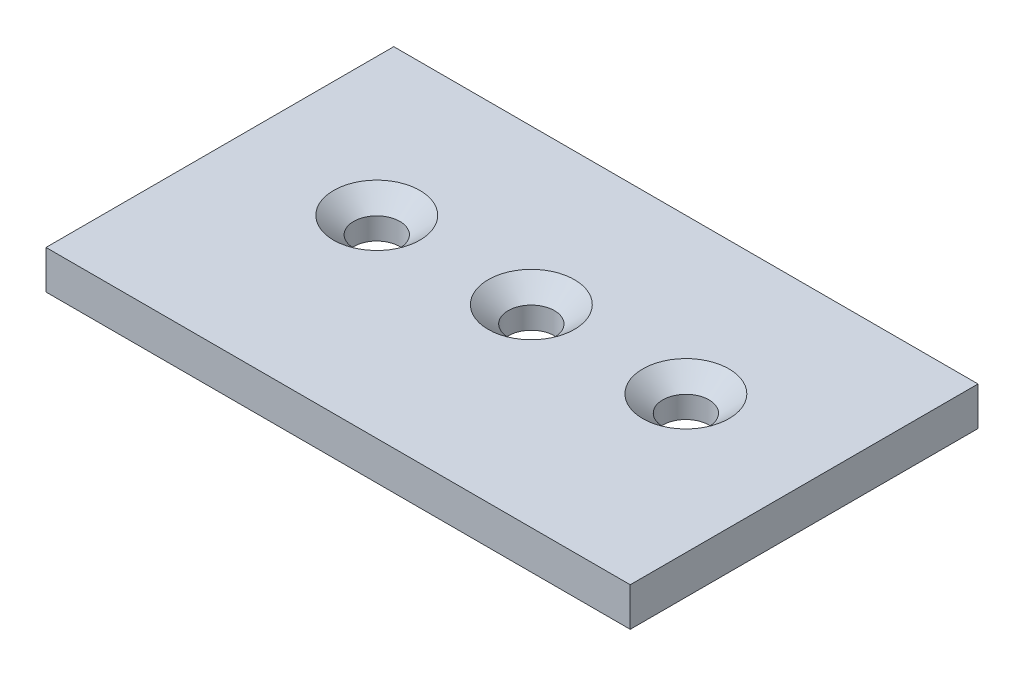
ISO-10303-21;
HEADER;
FILE_DESCRIPTION(('STEP AP214'),'2;1');
FILE_NAME('part.step','',(''),(''),'','','');
FILE_SCHEMA(('AUTOMOTIVE_DESIGN { 1 0 10303 214 1 1 1 1 }'));
ENDSEC;
DATA;
#1=APPLICATION_CONTEXT('core data for automotive mechanical design processes');
#2=APPLICATION_PROTOCOL_DEFINITION('international standard','automotive_design',2000,#1);
#3=PRODUCT_CONTEXT('',#1,'mechanical');
#4=PRODUCT('Part','Part','',(#3));
#5=PRODUCT_RELATED_PRODUCT_CATEGORY('part','',(#4));
#6=PRODUCT_DEFINITION_FORMATION('','',#4);
#7=PRODUCT_DEFINITION_CONTEXT('part definition',#1,'design');
#8=PRODUCT_DEFINITION('design','',#6,#7);
#9=PRODUCT_DEFINITION_SHAPE('','',#8);
#10=(LENGTH_UNIT() NAMED_UNIT(*) SI_UNIT(.MILLI.,.METRE.));
#11=(NAMED_UNIT(*) PLANE_ANGLE_UNIT() SI_UNIT($,.RADIAN.));
#12=(NAMED_UNIT(*) SI_UNIT($,.STERADIAN.) SOLID_ANGLE_UNIT());
#13=UNCERTAINTY_MEASURE_WITH_UNIT(LENGTH_MEASURE(1.E-05),#10,'distance_accuracy_value','');
#14=(GEOMETRIC_REPRESENTATION_CONTEXT(3) GLOBAL_UNCERTAINTY_ASSIGNED_CONTEXT((#13)) GLOBAL_UNIT_ASSIGNED_CONTEXT((#10,
#11,#12)) REPRESENTATION_CONTEXT('',''));
#15=CARTESIAN_POINT('',(0.,0.,0.));
#16=DIRECTION('',(0.,0.,1.));
#17=DIRECTION('',(1.,0.,0.));
#18=AXIS2_PLACEMENT_3D('',#15,#16,#17);
#19=CARTESIAN_POINT('',(0.,3.175,0.));
#20=DIRECTION('',(-1.,0.,0.));
#21=DIRECTION('',(0.,0.,1.));
#22=AXIS2_PLACEMENT_3D('',#19,#20,#21);
#23=PLANE('',#22);
#24=DIRECTION('',(0.,0.,-1.));
#25=VECTOR('',#24,1.);
#26=CARTESIAN_POINT('',(0.,0.,0.));
#27=LINE('',#26,#25);
#28=CARTESIAN_POINT('',(0.,0.,0.));
#29=VERTEX_POINT('',#28);
#30=CARTESIAN_POINT('',(0.,0.,-28.575));
#31=VERTEX_POINT('',#30);
#32=EDGE_CURVE('E96',#29,#31,#27,.T.);
#33=ORIENTED_EDGE('',*,*,#32,.T.);
#34=DIRECTION('',(0.,-1.,0.));
#35=VECTOR('',#34,1.);
#36=CARTESIAN_POINT('',(0.,3.175,-28.575));
#37=LINE('',#36,#35);
#38=CARTESIAN_POINT('',(0.,3.175,-28.575));
#39=VERTEX_POINT('',#38);
#40=EDGE_CURVE('E11',#39,#31,#37,.T.);
#41=ORIENTED_EDGE('',*,*,#40,.F.);
#42=DIRECTION('',(0.,0.,-1.));
#43=VECTOR('',#42,1.);
#44=CARTESIAN_POINT('',(0.,3.175,0.));
#45=LINE('',#44,#43);
#46=CARTESIAN_POINT('',(0.,3.175,0.));
#47=VERTEX_POINT('',#46);
#48=EDGE_CURVE('E84',#47,#39,#45,.T.);
#49=ORIENTED_EDGE('',*,*,#48,.F.);
#50=DIRECTION('',(0.,-1.,0.));
#51=VECTOR('',#50,1.);
#52=CARTESIAN_POINT('',(0.,3.175,0.));
#53=LINE('',#52,#51);
#54=EDGE_CURVE('E92',#47,#29,#53,.T.);
#55=ORIENTED_EDGE('',*,*,#54,.T.);
#56=EDGE_LOOP('',(#33,#41,#49,#55));
#57=FACE_BOUND('',#56,.T.);
#58=ADVANCED_FACE('F33',(#57),#23,.F.);
#59=CARTESIAN_POINT('',(0.,3.175,-28.575));
#60=DIRECTION('',(0.,0.,1.));
#61=DIRECTION('',(1.,0.,0.));
#62=AXIS2_PLACEMENT_3D('',#59,#60,#61);
#63=PLANE('',#62);
#64=DIRECTION('',(-1.,0.,0.));
#65=VECTOR('',#64,1.);
#66=CARTESIAN_POINT('',(0.,0.,-28.575));
#67=LINE('',#66,#65);
#68=CARTESIAN_POINT('',(-48.006,0.,-28.575));
#69=VERTEX_POINT('',#68);
#70=EDGE_CURVE('E88',#31,#69,#67,.T.);
#71=ORIENTED_EDGE('',*,*,#70,.T.);
#72=DIRECTION('',(0.,-1.,0.));
#73=VECTOR('',#72,1.);
#74=CARTESIAN_POINT('',(-48.006,3.175,-28.575));
#75=LINE('',#74,#73);
#76=CARTESIAN_POINT('',(-48.006,3.175,-28.575));
#77=VERTEX_POINT('',#76);
#78=EDGE_CURVE('E41',#77,#69,#75,.T.);
#79=ORIENTED_EDGE('',*,*,#78,.F.);
#80=DIRECTION('',(-1.,0.,0.));
#81=VECTOR('',#80,1.);
#82=CARTESIAN_POINT('',(0.,3.175,-28.575));
#83=LINE('',#82,#81);
#84=EDGE_CURVE('E79',#39,#77,#83,.T.);
#85=ORIENTED_EDGE('',*,*,#84,.F.);
#86=ORIENTED_EDGE('',*,*,#40,.T.);
#87=EDGE_LOOP('',(#71,#79,#85,#86));
#88=FACE_BOUND('',#87,.T.);
#89=ADVANCED_FACE('F87',(#88),#63,.F.);
#90=CARTESIAN_POINT('',(-48.006,3.175,0.));
#91=DIRECTION('',(1.,0.,0.));
#92=DIRECTION('',(0.,0.,-1.));
#93=AXIS2_PLACEMENT_3D('',#90,#91,#92);
#94=PLANE('',#93);
#95=DIRECTION('',(0.,0.,1.));
#96=VECTOR('',#95,1.);
#97=CARTESIAN_POINT('',(-48.006,0.,0.));
#98=LINE('',#97,#96);
#99=CARTESIAN_POINT('',(-48.006,0.,0.));
#100=VERTEX_POINT('',#99);
#101=EDGE_CURVE('E66',#69,#100,#98,.T.);
#102=ORIENTED_EDGE('',*,*,#101,.T.);
#103=DIRECTION('',(0.,-1.,0.));
#104=VECTOR('',#103,1.);
#105=CARTESIAN_POINT('',(-48.006,3.175,0.));
#106=LINE('',#105,#104);
#107=CARTESIAN_POINT('',(-48.006,3.175,0.));
#108=VERTEX_POINT('',#107);
#109=EDGE_CURVE('E89',#108,#100,#106,.T.);
#110=ORIENTED_EDGE('',*,*,#109,.F.);
#111=DIRECTION('',(0.,0.,1.));
#112=VECTOR('',#111,1.);
#113=CARTESIAN_POINT('',(-48.006,3.175,0.));
#114=LINE('',#113,#112);
#115=EDGE_CURVE('E82',#77,#108,#114,.T.);
#116=ORIENTED_EDGE('',*,*,#115,.F.);
#117=ORIENTED_EDGE('',*,*,#78,.T.);
#118=EDGE_LOOP('',(#102,#110,#116,#117));
#119=FACE_BOUND('',#118,.T.);
#120=ADVANCED_FACE('F90',(#119),#94,.F.);
#121=CARTESIAN_POINT('',(0.,3.175,0.));
#122=DIRECTION('',(0.,0.,-1.));
#123=DIRECTION('',(-1.,0.,0.));
#124=AXIS2_PLACEMENT_3D('',#121,#122,#123);
#125=PLANE('',#124);
#126=DIRECTION('',(1.,0.,0.));
#127=VECTOR('',#126,1.);
#128=CARTESIAN_POINT('',(0.,0.,0.));
#129=LINE('',#128,#127);
#130=EDGE_CURVE('E72',#100,#29,#129,.T.);
#131=ORIENTED_EDGE('',*,*,#130,.T.);
#132=ORIENTED_EDGE('',*,*,#54,.F.);
#133=DIRECTION('',(1.,0.,0.));
#134=VECTOR('',#133,1.);
#135=CARTESIAN_POINT('',(0.,3.175,0.));
#136=LINE('',#135,#134);
#137=EDGE_CURVE('E49',#108,#47,#136,.T.);
#138=ORIENTED_EDGE('',*,*,#137,.F.);
#139=ORIENTED_EDGE('',*,*,#109,.T.);
#140=EDGE_LOOP('',(#131,#132,#138,#139));
#141=FACE_BOUND('',#140,.T.);
#142=ADVANCED_FACE('F104',(#141),#125,.F.);
#143=CARTESIAN_POINT('',(0.,3.175,0.));
#144=DIRECTION('',(0.,1.,0.));
#145=DIRECTION('',(0.,0.,1.));
#146=AXIS2_PLACEMENT_3D('',#143,#144,#145);
#147=PLANE('',#146);
#148=CARTESIAN_POINT('',(-11.303,3.175,-15.875));
#149=DIRECTION('',(0.,1.,0.));
#150=DIRECTION('',(0.,0.,1.));
#151=AXIS2_PLACEMENT_3D('',#148,#149,#150);
#152=CIRCLE('',#151,3.5433);
#153=CARTESIAN_POINT('',(-11.303,3.175,-12.3317));
#154=VERTEX_POINT('',#153);
#155=EDGE_CURVE('E133',#154,#154,#152,.T.);
#156=ORIENTED_EDGE('',*,*,#155,.F.);
#157=EDGE_LOOP('',(#156));
#158=FACE_BOUND('',#157,.T.);
#159=CARTESIAN_POINT('',(-36.703,3.175,-15.875));
#160=DIRECTION('',(0.,1.,0.));
#161=DIRECTION('',(0.,0.,1.));
#162=AXIS2_PLACEMENT_3D('',#159,#160,#161);
#163=CIRCLE('',#162,3.5433);
#164=CARTESIAN_POINT('',(-36.703,3.175,-12.3317));
#165=VERTEX_POINT('',#164);
#166=EDGE_CURVE('E124',#165,#165,#163,.T.);
#167=ORIENTED_EDGE('',*,*,#166,.F.);
#168=EDGE_LOOP('',(#167));
#169=FACE_BOUND('',#168,.T.);
#170=CARTESIAN_POINT('',(-24.003,3.175,-15.875));
#171=DIRECTION('',(0.,1.,0.));
#172=DIRECTION('',(0.,0.,1.));
#173=AXIS2_PLACEMENT_3D('',#170,#171,#172);
#174=CIRCLE('',#173,3.5433);
#175=CARTESIAN_POINT('',(-24.003,3.175,-12.3317));
#176=VERTEX_POINT('',#175);
#177=EDGE_CURVE('E115',#176,#176,#174,.T.);
#178=ORIENTED_EDGE('',*,*,#177,.F.);
#179=EDGE_LOOP('',(#178));
#180=FACE_BOUND('',#179,.T.);
#181=ORIENTED_EDGE('',*,*,#48,.T.);
#182=ORIENTED_EDGE('',*,*,#84,.T.);
#183=ORIENTED_EDGE('',*,*,#115,.T.);
#184=ORIENTED_EDGE('',*,*,#137,.T.);
#185=EDGE_LOOP('',(#181,#182,#183,#184));
#186=FACE_BOUND('',#185,.T.);
#187=ADVANCED_FACE('F80',(#158,#169,#180,#186),#147,.T.);
#188=CARTESIAN_POINT('',(0.,0.,0.));
#189=DIRECTION('',(0.,1.,0.));
#190=DIRECTION('',(0.,0.,1.));
#191=AXIS2_PLACEMENT_3D('',#188,#189,#190);
#192=PLANE('',#191);
#193=CARTESIAN_POINT('',(-11.303,0.,-15.875));
#194=DIRECTION('',(0.,1.,0.));
#195=DIRECTION('',(0.,0.,1.));
#196=AXIS2_PLACEMENT_3D('',#193,#194,#195);
#197=CIRCLE('',#196,1.89865);
#198=CARTESIAN_POINT('',(-11.303,0.,-13.97635));
#199=VERTEX_POINT('',#198);
#200=EDGE_CURVE('E127',#199,#199,#197,.T.);
#201=ORIENTED_EDGE('',*,*,#200,.T.);
#202=EDGE_LOOP('',(#201));
#203=FACE_BOUND('',#202,.T.);
#204=CARTESIAN_POINT('',(-36.703,0.,-15.875));
#205=DIRECTION('',(0.,1.,0.));
#206=DIRECTION('',(0.,0.,1.));
#207=AXIS2_PLACEMENT_3D('',#204,#205,#206);
#208=CIRCLE('',#207,1.89865);
#209=CARTESIAN_POINT('',(-36.703,0.,-13.97635));
#210=VERTEX_POINT('',#209);
#211=EDGE_CURVE('E118',#210,#210,#208,.T.);
#212=ORIENTED_EDGE('',*,*,#211,.T.);
#213=EDGE_LOOP('',(#212));
#214=FACE_BOUND('',#213,.T.);
#215=CARTESIAN_POINT('',(-24.003,0.,-15.875));
#216=DIRECTION('',(0.,1.,0.));
#217=DIRECTION('',(0.,0.,1.));
#218=AXIS2_PLACEMENT_3D('',#215,#216,#217);
#219=CIRCLE('',#218,1.89865);
#220=CARTESIAN_POINT('',(-24.003,0.,-13.97635));
#221=VERTEX_POINT('',#220);
#222=EDGE_CURVE('E99',#221,#221,#219,.T.);
#223=ORIENTED_EDGE('',*,*,#222,.T.);
#224=EDGE_LOOP('',(#223));
#225=FACE_BOUND('',#224,.T.);
#226=ORIENTED_EDGE('',*,*,#32,.F.);
#227=ORIENTED_EDGE('',*,*,#130,.F.);
#228=ORIENTED_EDGE('',*,*,#101,.F.);
#229=ORIENTED_EDGE('',*,*,#70,.F.);
#230=EDGE_LOOP('',(#226,#227,#228,#229));
#231=FACE_BOUND('',#230,.T.);
#232=ADVANCED_FACE('F107',(#203,#214,#225,#231),#192,.F.);
#233=CARTESIAN_POINT('',(-24.003,3.175,-15.875));
#234=DIRECTION('',(0.,1.,0.));
#235=DIRECTION('',(0.,0.,1.));
#236=AXIS2_PLACEMENT_3D('',#233,#234,#235);
#237=CYLINDRICAL_SURFACE('',#236,1.89864999999999);
#238=ORIENTED_EDGE('',*,*,#222,.F.);
#239=EDGE_LOOP('',(#238));
#240=FACE_BOUND('',#239,.T.);
#241=CARTESIAN_POINT('',(-24.003,1.79497479158429,-15.875));
#242=DIRECTION('',(0.,1.,0.));
#243=DIRECTION('',(0.,0.,1.));
#244=AXIS2_PLACEMENT_3D('',#241,#242,#243);
#245=CIRCLE('',#244,1.89864999999999);
#246=CARTESIAN_POINT('',(-24.003,1.79497479158429,-13.97635));
#247=VERTEX_POINT('',#246);
#248=EDGE_CURVE('E112',#247,#247,#245,.T.);
#249=ORIENTED_EDGE('',*,*,#248,.T.);
#250=EDGE_LOOP('',(#249));
#251=FACE_BOUND('',#250,.T.);
#252=ADVANCED_FACE('F149',(#240,#251),#237,.F.);
#253=CARTESIAN_POINT('',(-24.003,3.175,-15.875));
#254=DIRECTION('',(0.,1.,0.));
#255=DIRECTION('',(0.,0.,1.));
#256=AXIS2_PLACEMENT_3D('',#253,#254,#255);
#257=CONICAL_SURFACE('',#256,3.5433,0.872664625997169);
#258=ORIENTED_EDGE('',*,*,#248,.F.);
#259=EDGE_LOOP('',(#258));
#260=FACE_BOUND('',#259,.T.);
#261=ORIENTED_EDGE('',*,*,#177,.T.);
#262=EDGE_LOOP('',(#261));
#263=FACE_BOUND('',#262,.T.);
#264=ADVANCED_FACE('F146',(#260,#263),#257,.F.);
#265=CARTESIAN_POINT('',(-36.703,3.175,-15.875));
#266=DIRECTION('',(0.,1.,0.));
#267=DIRECTION('',(0.,0.,1.));
#268=AXIS2_PLACEMENT_3D('',#265,#266,#267);
#269=CYLINDRICAL_SURFACE('',#268,1.89864999999999);
#270=ORIENTED_EDGE('',*,*,#211,.F.);
#271=EDGE_LOOP('',(#270));
#272=FACE_BOUND('',#271,.T.);
#273=CARTESIAN_POINT('',(-36.703,1.79497479158429,-15.875));
#274=DIRECTION('',(0.,1.,0.));
#275=DIRECTION('',(0.,0.,1.));
#276=AXIS2_PLACEMENT_3D('',#273,#274,#275);
#277=CIRCLE('',#276,1.89864999999999);
#278=CARTESIAN_POINT('',(-36.703,1.79497479158429,-13.97635));
#279=VERTEX_POINT('',#278);
#280=EDGE_CURVE('E121',#279,#279,#277,.T.);
#281=ORIENTED_EDGE('',*,*,#280,.T.);
#282=EDGE_LOOP('',(#281));
#283=FACE_BOUND('',#282,.T.);
#284=ADVANCED_FACE('F148',(#272,#283),#269,.F.);
#285=CARTESIAN_POINT('',(-36.703,3.175,-15.875));
#286=DIRECTION('',(0.,1.,0.));
#287=DIRECTION('',(0.,0.,1.));
#288=AXIS2_PLACEMENT_3D('',#285,#286,#287);
#289=CONICAL_SURFACE('',#288,3.5433,0.872664625997169);
#290=ORIENTED_EDGE('',*,*,#280,.F.);
#291=EDGE_LOOP('',(#290));
#292=FACE_BOUND('',#291,.T.);
#293=ORIENTED_EDGE('',*,*,#166,.T.);
#294=EDGE_LOOP('',(#293));
#295=FACE_BOUND('',#294,.T.);
#296=ADVANCED_FACE('F156',(#292,#295),#289,.F.);
#297=CARTESIAN_POINT('',(-11.303,3.175,-15.875));
#298=DIRECTION('',(0.,1.,0.));
#299=DIRECTION('',(0.,0.,1.));
#300=AXIS2_PLACEMENT_3D('',#297,#298,#299);
#301=CYLINDRICAL_SURFACE('',#300,1.89864999999999);
#302=ORIENTED_EDGE('',*,*,#200,.F.);
#303=EDGE_LOOP('',(#302));
#304=FACE_BOUND('',#303,.T.);
#305=CARTESIAN_POINT('',(-11.303,1.79497479158429,-15.875));
#306=DIRECTION('',(0.,1.,0.));
#307=DIRECTION('',(0.,0.,1.));
#308=AXIS2_PLACEMENT_3D('',#305,#306,#307);
#309=CIRCLE('',#308,1.89864999999999);
#310=CARTESIAN_POINT('',(-11.303,1.79497479158429,-13.97635));
#311=VERTEX_POINT('',#310);
#312=EDGE_CURVE('E130',#311,#311,#309,.T.);
#313=ORIENTED_EDGE('',*,*,#312,.T.);
#314=EDGE_LOOP('',(#313));
#315=FACE_BOUND('',#314,.T.);
#316=ADVANCED_FACE('F188',(#304,#315),#301,.F.);
#317=CARTESIAN_POINT('',(-11.303,3.175,-15.875));
#318=DIRECTION('',(0.,1.,0.));
#319=DIRECTION('',(0.,0.,1.));
#320=AXIS2_PLACEMENT_3D('',#317,#318,#319);
#321=CONICAL_SURFACE('',#320,3.5433,0.872664625997169);
#322=ORIENTED_EDGE('',*,*,#312,.F.);
#323=EDGE_LOOP('',(#322));
#324=FACE_BOUND('',#323,.T.);
#325=ORIENTED_EDGE('',*,*,#155,.T.);
#326=EDGE_LOOP('',(#325));
#327=FACE_BOUND('',#326,.T.);
#328=ADVANCED_FACE('F137',(#324,#327),#321,.F.);
#329=CLOSED_SHELL('',(#58,#89,#120,#142,#187,#232,#252,#264,#284,#296,#316,#328));
#330=MANIFOLD_SOLID_BREP('B2',#329);
#331=ADVANCED_BREP_SHAPE_REPRESENTATION('',(#18,#330),#14);
#332=SHAPE_DEFINITION_REPRESENTATION(#9,#331);
ENDSEC;
END-ISO-10303-21;
